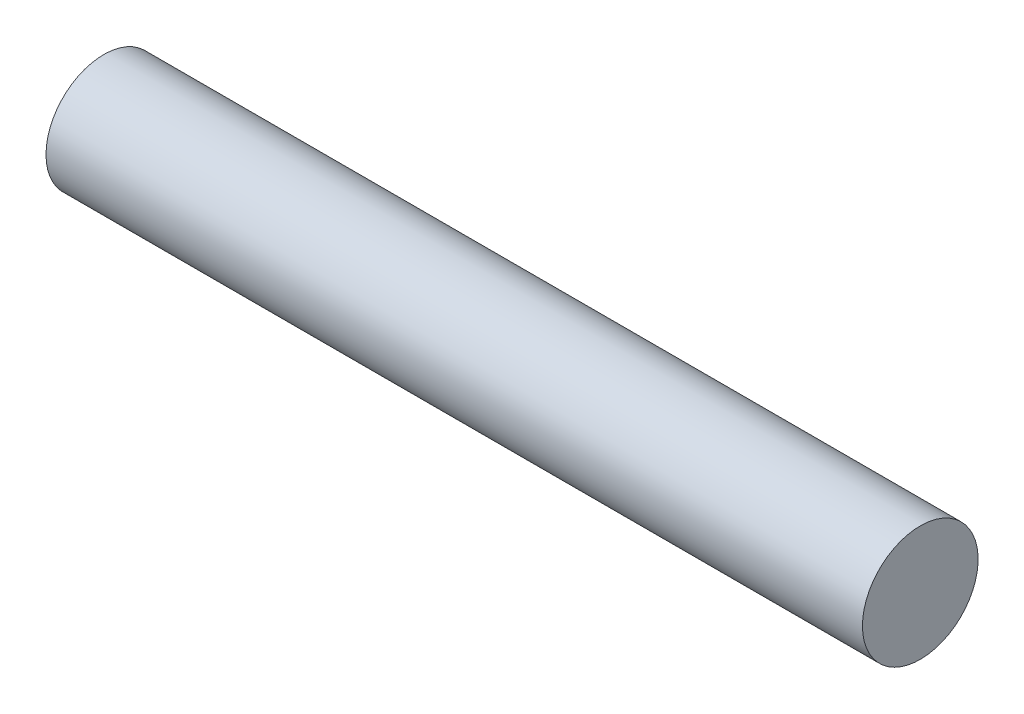
ISO-10303-21;
HEADER;
FILE_DESCRIPTION(('STEP AP214'),'2;1');
FILE_NAME('part.step','',(''),(''),'','','');
FILE_SCHEMA(('AUTOMOTIVE_DESIGN { 1 0 10303 214 1 1 1 1 }'));
ENDSEC;
DATA;
#1=APPLICATION_CONTEXT('core data for automotive mechanical design processes');
#2=APPLICATION_PROTOCOL_DEFINITION('international standard','automotive_design',2000,#1);
#3=PRODUCT_CONTEXT('',#1,'mechanical');
#4=PRODUCT('Part','Part','',(#3));
#5=PRODUCT_RELATED_PRODUCT_CATEGORY('part','',(#4));
#6=PRODUCT_DEFINITION_FORMATION('','',#4);
#7=PRODUCT_DEFINITION_CONTEXT('part definition',#1,'design');
#8=PRODUCT_DEFINITION('design','',#6,#7);
#9=PRODUCT_DEFINITION_SHAPE('','',#8);
#10=(LENGTH_UNIT() NAMED_UNIT(*) SI_UNIT(.MILLI.,.METRE.));
#11=(NAMED_UNIT(*) PLANE_ANGLE_UNIT() SI_UNIT($,.RADIAN.));
#12=(NAMED_UNIT(*) SI_UNIT($,.STERADIAN.) SOLID_ANGLE_UNIT());
#13=UNCERTAINTY_MEASURE_WITH_UNIT(LENGTH_MEASURE(1.E-05),#10,'distance_accuracy_value','');
#14=(GEOMETRIC_REPRESENTATION_CONTEXT(3) GLOBAL_UNCERTAINTY_ASSIGNED_CONTEXT((#13)) GLOBAL_UNIT_ASSIGNED_CONTEXT((#10,
#11,#12)) REPRESENTATION_CONTEXT('',''));
#15=CARTESIAN_POINT('',(0.,0.,0.));
#16=DIRECTION('',(0.,0.,1.));
#17=DIRECTION('',(1.,0.,0.));
#18=AXIS2_PLACEMENT_3D('',#15,#16,#17);
#19=CARTESIAN_POINT('',(0.,17.,0.));
#20=DIRECTION('',(1.,0.,0.));
#21=DIRECTION('',(0.,0.,-1.));
#22=AXIS2_PLACEMENT_3D('',#19,#20,#21);
#23=PLANE('',#22);
#24=CARTESIAN_POINT('',(0.,0.,0.));
#25=DIRECTION('',(-1.,0.,0.));
#26=DIRECTION('',(0.,0.,1.));
#27=AXIS2_PLACEMENT_3D('',#24,#25,#26);
#28=CIRCLE('',#27,17.);
#29=CARTESIAN_POINT('',(0.,0.,17.));
#30=VERTEX_POINT('',#29);
#31=EDGE_CURVE('E41',#30,#30,#28,.T.);
#32=ORIENTED_EDGE('',*,*,#31,.T.);
#33=EDGE_LOOP('',(#32));
#34=FACE_BOUND('',#33,.T.);
#35=ADVANCED_FACE('F35',(#34),#23,.F.);
#36=CARTESIAN_POINT('',(240.,0.,0.));
#37=DIRECTION('',(-1.,0.,0.));
#38=DIRECTION('',(0.,0.,1.));
#39=AXIS2_PLACEMENT_3D('',#36,#37,#38);
#40=PLANE('',#39);
#41=CARTESIAN_POINT('',(240.,0.,0.));
#42=DIRECTION('',(-1.,0.,0.));
#43=DIRECTION('',(0.,0.,1.));
#44=AXIS2_PLACEMENT_3D('',#41,#42,#43);
#45=CIRCLE('',#44,17.);
#46=CARTESIAN_POINT('',(240.,0.,17.));
#47=VERTEX_POINT('',#46);
#48=EDGE_CURVE('E10',#47,#47,#45,.T.);
#49=ORIENTED_EDGE('',*,*,#48,.F.);
#50=EDGE_LOOP('',(#49));
#51=FACE_BOUND('',#50,.T.);
#52=ADVANCED_FACE('F50',(#51),#40,.F.);
#53=CARTESIAN_POINT('',(0.,0.,0.));
#54=DIRECTION('',(-1.,0.,0.));
#55=DIRECTION('',(0.,0.,1.));
#56=AXIS2_PLACEMENT_3D('',#53,#54,#55);
#57=CYLINDRICAL_SURFACE('',#56,17.);
#58=ORIENTED_EDGE('',*,*,#31,.F.);
#59=EDGE_LOOP('',(#58));
#60=FACE_BOUND('',#59,.T.);
#61=ORIENTED_EDGE('',*,*,#48,.T.);
#62=EDGE_LOOP('',(#61));
#63=FACE_BOUND('',#62,.T.);
#64=ADVANCED_FACE('F48',(#60,#63),#57,.T.);
#65=CLOSED_SHELL('',(#35,#52,#64));
#66=MANIFOLD_SOLID_BREP('B2',#65);
#67=ADVANCED_BREP_SHAPE_REPRESENTATION('',(#18,#66),#14);
#68=SHAPE_DEFINITION_REPRESENTATION(#9,#67);
ENDSEC;
END-ISO-10303-21;
